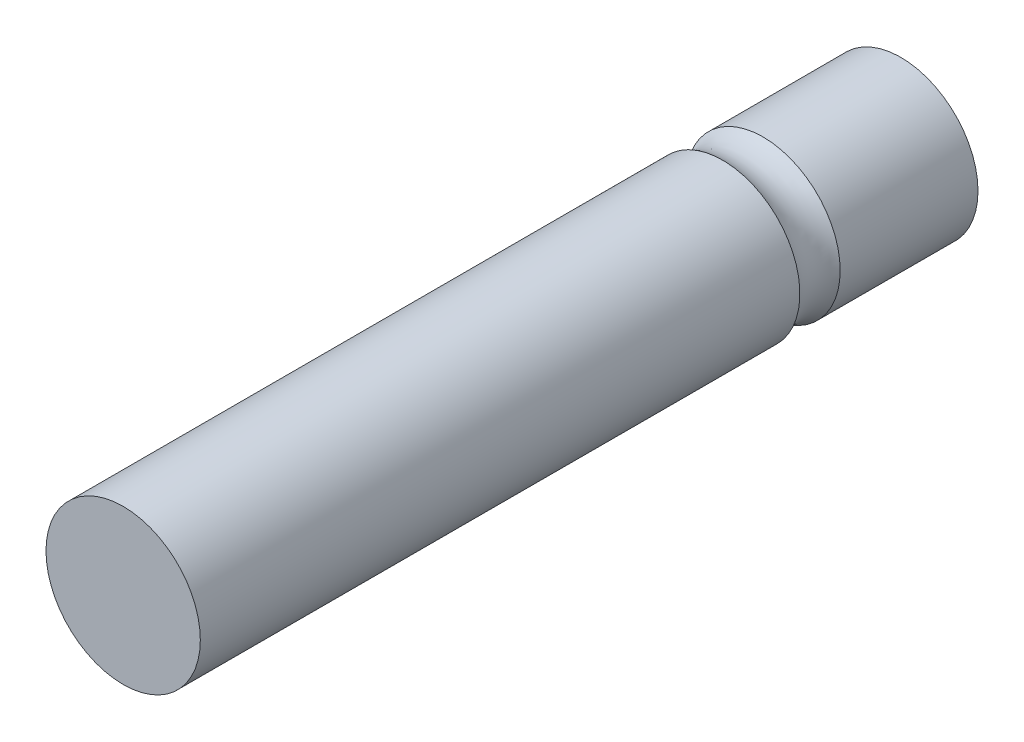
ISO-10303-21;
HEADER;
FILE_DESCRIPTION(('STEP AP214'),'2;1');
FILE_NAME('part.step','',(''),(''),'','','');
FILE_SCHEMA(('AUTOMOTIVE_DESIGN { 1 0 10303 214 1 1 1 1 }'));
ENDSEC;
DATA;
#1=APPLICATION_CONTEXT('core data for automotive mechanical design processes');
#2=APPLICATION_PROTOCOL_DEFINITION('international standard','automotive_design',2000,#1);
#3=PRODUCT_CONTEXT('',#1,'mechanical');
#4=PRODUCT('Part','Part','',(#3));
#5=PRODUCT_RELATED_PRODUCT_CATEGORY('part','',(#4));
#6=PRODUCT_DEFINITION_FORMATION('','',#4);
#7=PRODUCT_DEFINITION_CONTEXT('part definition',#1,'design');
#8=PRODUCT_DEFINITION('design','',#6,#7);
#9=PRODUCT_DEFINITION_SHAPE('','',#8);
#10=(LENGTH_UNIT() NAMED_UNIT(*) SI_UNIT(.MILLI.,.METRE.));
#11=(NAMED_UNIT(*) PLANE_ANGLE_UNIT() SI_UNIT($,.RADIAN.));
#12=(NAMED_UNIT(*) SI_UNIT($,.STERADIAN.) SOLID_ANGLE_UNIT());
#13=UNCERTAINTY_MEASURE_WITH_UNIT(LENGTH_MEASURE(1.E-05),#10,'distance_accuracy_value','');
#14=(GEOMETRIC_REPRESENTATION_CONTEXT(3) GLOBAL_UNCERTAINTY_ASSIGNED_CONTEXT((#13)) GLOBAL_UNIT_ASSIGNED_CONTEXT((#10,
#11,#12)) REPRESENTATION_CONTEXT('',''));
#15=CARTESIAN_POINT('',(0.,0.,0.));
#16=DIRECTION('',(0.,0.,1.));
#17=DIRECTION('',(1.,0.,0.));
#18=AXIS2_PLACEMENT_3D('',#15,#16,#17);
#19=CARTESIAN_POINT('',(0.,0.,32.));
#20=DIRECTION('',(0.,0.,-1.));
#21=DIRECTION('',(-1.,0.,0.));
#22=AXIS2_PLACEMENT_3D('',#19,#20,#21);
#23=CYLINDRICAL_SURFACE('',#22,3.175);
#24=CARTESIAN_POINT('',(0.,0.,5.67084380241116));
#25=DIRECTION('',(0.,0.,1.));
#26=DIRECTION('',(1.,0.,0.));
#27=AXIS2_PLACEMENT_3D('',#24,#25,#26);
#28=CIRCLE('',#27,3.175);
#29=CARTESIAN_POINT('',(3.175,0.,5.67084380241116));
#30=VERTEX_POINT('',#29);
#31=EDGE_CURVE('E43',#30,#30,#28,.F.);
#32=ORIENTED_EDGE('',*,*,#31,.T.);
#33=EDGE_LOOP('',(#32));
#34=FACE_BOUND('',#33,.T.);
#35=CARTESIAN_POINT('',(0.,0.,0.));
#36=DIRECTION('',(0.,0.,1.));
#37=DIRECTION('',(1.,0.,0.));
#38=AXIS2_PLACEMENT_3D('',#35,#36,#37);
#39=CIRCLE('',#38,3.175);
#40=CARTESIAN_POINT('',(3.175,0.,0.));
#41=VERTEX_POINT('',#40);
#42=EDGE_CURVE('E47',#41,#41,#39,.T.);
#43=ORIENTED_EDGE('',*,*,#42,.T.);
#44=EDGE_LOOP('',(#43));
#45=FACE_BOUND('',#44,.T.);
#46=ADVANCED_FACE('F39',(#34,#45),#23,.T.);
#47=CARTESIAN_POINT('',(0.,0.,0.));
#48=DIRECTION('',(0.,0.,1.));
#49=DIRECTION('',(1.,0.,0.));
#50=AXIS2_PLACEMENT_3D('',#47,#48,#49);
#51=PLANE('',#50);
#52=ORIENTED_EDGE('',*,*,#42,.F.);
#53=EDGE_LOOP('',(#52));
#54=FACE_BOUND('',#53,.T.);
#55=ADVANCED_FACE('F65',(#54),#51,.F.);
#56=CARTESIAN_POINT('',(0.,0.,6.5));
#57=DIRECTION('',(0.,0.,-1.));
#58=DIRECTION('',(-1.,0.,0.));
#59=AXIS2_PLACEMENT_3D('',#56,#57,#58);
#60=TOROIDAL_SURFACE('',#59,4.425,1.5);
#61=CARTESIAN_POINT('',(0.,0.,7.32915619758884));
#62=DIRECTION('',(0.,0.,-1.));
#63=DIRECTION('',(-1.,0.,0.));
#64=AXIS2_PLACEMENT_3D('',#61,#62,#63);
#65=CIRCLE('',#64,3.175);
#66=CARTESIAN_POINT('',(-3.175,0.,7.32915619758884));
#67=VERTEX_POINT('',#66);
#68=EDGE_CURVE('E53',#67,#67,#65,.F.);
#69=ORIENTED_EDGE('',*,*,#68,.F.);
#70=EDGE_LOOP('',(#69));
#71=FACE_BOUND('',#70,.T.);
#72=ORIENTED_EDGE('',*,*,#31,.F.);
#73=EDGE_LOOP('',(#72));
#74=FACE_BOUND('',#73,.T.);
#75=ADVANCED_FACE('F62',(#71,#74),#60,.F.);
#76=CARTESIAN_POINT('',(0.,0.,32.));
#77=DIRECTION('',(0.,0.,1.));
#78=DIRECTION('',(1.,0.,0.));
#79=AXIS2_PLACEMENT_3D('',#76,#77,#78);
#80=PLANE('',#79);
#81=CARTESIAN_POINT('',(0.,0.,32.));
#82=DIRECTION('',(0.,0.,1.));
#83=DIRECTION('',(1.,0.,0.));
#84=AXIS2_PLACEMENT_3D('',#81,#82,#83);
#85=CIRCLE('',#84,3.175);
#86=CARTESIAN_POINT('',(3.175,0.,32.));
#87=VERTEX_POINT('',#86);
#88=EDGE_CURVE('E10',#87,#87,#85,.T.);
#89=ORIENTED_EDGE('',*,*,#88,.T.);
#90=EDGE_LOOP('',(#89));
#91=FACE_BOUND('',#90,.T.);
#92=ADVANCED_FACE('F64',(#91),#80,.T.);
#93=ORIENTED_EDGE('',*,*,#68,.T.);
#94=EDGE_LOOP('',(#93));
#95=FACE_BOUND('',#94,.T.);
#96=ORIENTED_EDGE('',*,*,#88,.F.);
#97=EDGE_LOOP('',(#96));
#98=FACE_BOUND('',#97,.T.);
#99=ADVANCED_FACE('F41',(#95,#98),#23,.T.);
#100=CLOSED_SHELL('',(#46,#55,#75,#92,#99));
#101=MANIFOLD_SOLID_BREP('B2',#100);
#102=ADVANCED_BREP_SHAPE_REPRESENTATION('',(#18,#101),#14);
#103=SHAPE_DEFINITION_REPRESENTATION(#9,#102);
ENDSEC;
END-ISO-10303-21;
